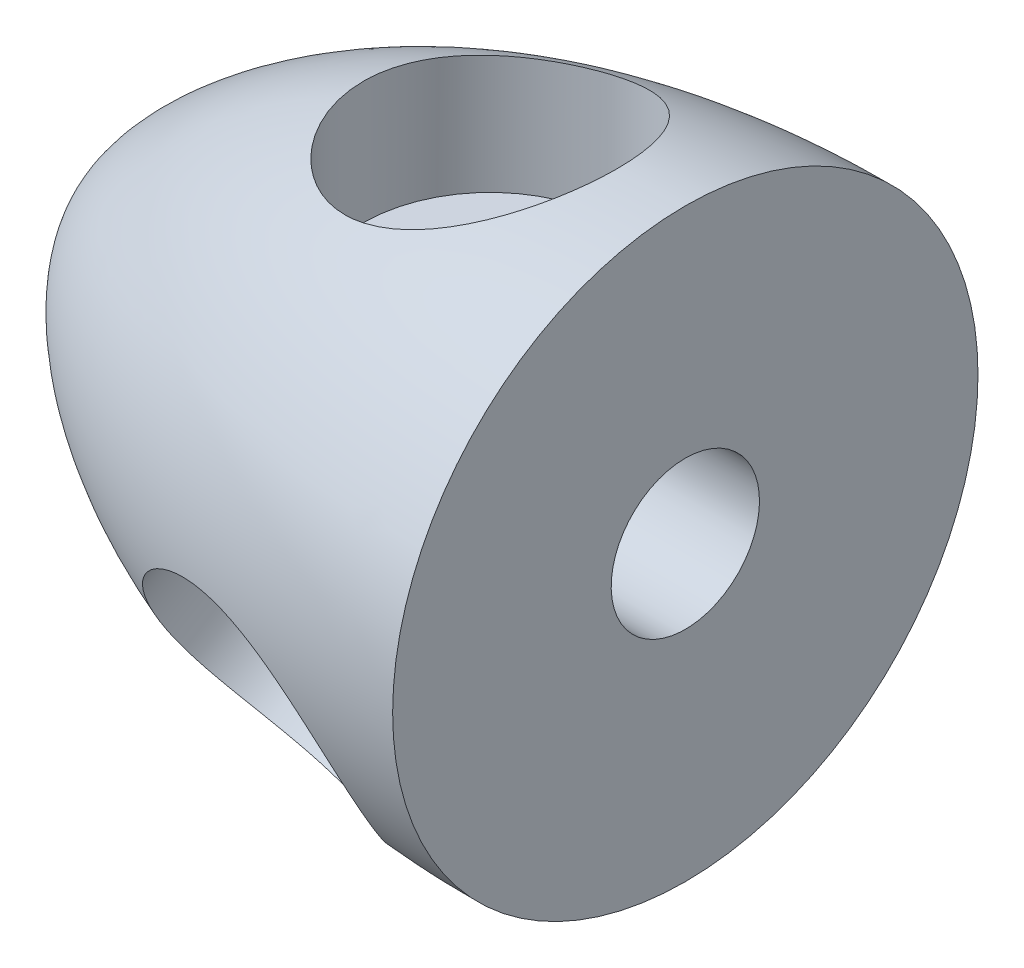
ISO-10303-21;
HEADER;
FILE_DESCRIPTION(('STEP AP214'),'2;1');
FILE_NAME('part.step','',(''),(''),'','','');
FILE_SCHEMA(('AUTOMOTIVE_DESIGN { 1 0 10303 214 1 1 1 1 }'));
ENDSEC;
DATA;
#1=APPLICATION_CONTEXT('core data for automotive mechanical design processes');
#2=APPLICATION_PROTOCOL_DEFINITION('international standard','automotive_design',2000,#1);
#3=PRODUCT_CONTEXT('',#1,'mechanical');
#4=PRODUCT('Part','Part','',(#3));
#5=PRODUCT_RELATED_PRODUCT_CATEGORY('part','',(#4));
#6=PRODUCT_DEFINITION_FORMATION('','',#4);
#7=PRODUCT_DEFINITION_CONTEXT('part definition',#1,'design');
#8=PRODUCT_DEFINITION('design','',#6,#7);
#9=PRODUCT_DEFINITION_SHAPE('','',#8);
#10=(LENGTH_UNIT() NAMED_UNIT(*) SI_UNIT(.MILLI.,.METRE.));
#11=(NAMED_UNIT(*) PLANE_ANGLE_UNIT() SI_UNIT($,.RADIAN.));
#12=(NAMED_UNIT(*) SI_UNIT($,.STERADIAN.) SOLID_ANGLE_UNIT());
#13=UNCERTAINTY_MEASURE_WITH_UNIT(LENGTH_MEASURE(1.E-05),#10,'distance_accuracy_value','');
#14=(GEOMETRIC_REPRESENTATION_CONTEXT(3) GLOBAL_UNCERTAINTY_ASSIGNED_CONTEXT((#13)) GLOBAL_UNIT_ASSIGNED_CONTEXT((#10,
#11,#12)) REPRESENTATION_CONTEXT('',''));
#15=CARTESIAN_POINT('',(0.,0.,0.));
#16=DIRECTION('',(0.,0.,1.));
#17=DIRECTION('',(1.,0.,0.));
#18=AXIS2_PLACEMENT_3D('',#15,#16,#17);
#19=CARTESIAN_POINT('',(0.,19.05,0.));
#20=CARTESIAN_POINT('',(-25.41,19.05,0.));
#21=CARTESIAN_POINT('',(-38.1,6.31666666666666,0.));
#22=CARTESIAN_POINT('',(-38.1,0.,0.));
#23=B_SPLINE_CURVE_WITH_KNOTS('',3,(#19,#20,#21,#22),.UNSPECIFIED.,.F.,.F.,(4,4),(0.,1.),.UNSPECIFIED.);
#24=CARTESIAN_POINT('',(0.,0.,0.));
#25=DIRECTION('',(1.,0.,0.));
#26=AXIS1_PLACEMENT('',#24,#25);
#27=SURFACE_OF_REVOLUTION('',#23,#26);
#28=CARTESIAN_POINT('',(-12.7,-15.0807249649027,9.61058185418369));
#29=CARTESIAN_POINT('',(-12.4605393669485,-15.1069278666825,9.65596906371833));
#30=CARTESIAN_POINT('',(-12.221808118706,-15.1258316157201,9.70956481400283));
#31=CARTESIAN_POINT('',(-11.7476073797647,-15.1490173761714,9.83220492568797));
#32=CARTESIAN_POINT('',(-11.5121385842366,-15.1532963176068,9.90125252743574));
#33=CARTESIAN_POINT('',(-11.045904513232,-15.1472399577647,10.0536959752813));
#34=CARTESIAN_POINT('',(-10.8151427802404,-15.1368940338036,10.137102212032));
#35=CARTESIAN_POINT('',(-10.3598307103795,-15.1015845420369,10.3169996420026));
#36=CARTESIAN_POINT('',(-10.135282904689,-15.0766151066774,10.413496075599));
#37=CARTESIAN_POINT('',(-9.69455055848924,-15.0121858162572,10.6178627940247));
#38=CARTESIAN_POINT('',(-9.47833937087406,-14.972777256637,10.7256918638841));
#39=CARTESIAN_POINT('',(-9.05453897157765,-14.8794464883134,10.9517069299745));
#40=CARTESIAN_POINT('',(-8.84695296078829,-14.825518946028,11.0698967214589));
#41=CARTESIAN_POINT('',(-8.44163353549176,-14.7031607649492,11.315230158228));
#42=CARTESIAN_POINT('',(-8.24389834225954,-14.6347327562595,11.4423721769634));
#43=CARTESIAN_POINT('',(-7.85932959360645,-14.4833598925009,11.7042745304693));
#44=CARTESIAN_POINT('',(-7.67249609672024,-14.4004149594956,11.8390349061376));
#45=CARTESIAN_POINT('',(-7.30255493412424,-14.2158869266265,12.1211158811441));
#46=CARTESIAN_POINT('',(-7.12000772587379,-14.1136252990654,12.2687290368562));
#47=CARTESIAN_POINT('',(-6.76941100154962,-13.8933427961317,12.569124046286));
#48=CARTESIAN_POINT('',(-6.60135453097225,-13.7753295504689,12.7219033710498));
#49=CARTESIAN_POINT('',(-6.2809035756407,-13.52359523197,13.0311272524021));
#50=CARTESIAN_POINT('',(-6.12851637427941,-13.3898669157838,13.1875734723209));
#51=CARTESIAN_POINT('',(-5.84095434989063,-13.1071101476181,13.5022684192315));
#52=CARTESIAN_POINT('',(-5.70577067283612,-12.9580896378949,13.6605161729762));
#53=CARTESIAN_POINT('',(-5.45875404251215,-12.651182176542,13.9710404308246));
#54=CARTESIAN_POINT('',(-5.34622579869089,-12.4938522486059,14.1233138524649));
#55=CARTESIAN_POINT('',(-5.13959288681326,-12.166207063187,14.4262107244172));
#56=CARTESIAN_POINT('',(-5.04547861487266,-11.9958986394436,14.5768349959424));
#57=CARTESIAN_POINT('',(-4.8767951845897,-11.6432494424563,14.8747482570029));
#58=CARTESIAN_POINT('',(-4.8022171610913,-11.460914173937,15.0220387315301));
#59=CARTESIAN_POINT('',(-4.67356441519808,-11.0853881684958,15.3116496454441));
#60=CARTESIAN_POINT('',(-4.61948743903761,-10.892198627512,15.453970629585));
#61=CARTESIAN_POINT('',(-4.53696860474139,-10.5163365125172,15.7180698823627));
#62=CARTESIAN_POINT('',(-4.50650179678199,-10.3345483331358,15.8404780287937));
#63=CARTESIAN_POINT('',(-4.46317468703724,-9.96474655992053,16.0788276686682));
#64=CARTESIAN_POINT('',(-4.45031307992681,-9.77673342869007,16.19476964093));
#65=CARTESIAN_POINT('',(-4.44236044599405,-9.39599612809252,16.4191576981804));
#66=CARTESIAN_POINT('',(-4.44726419038948,-9.20327336147216,16.5276059791725));
#67=CARTESIAN_POINT('',(-4.47476770642783,-8.81462758311886,16.7362002716799));
#68=CARTESIAN_POINT('',(-4.49736713851158,-8.61870463286428,16.8363464424619));
#69=CARTESIAN_POINT('',(-4.55819630809723,-8.23644609934095,17.022242003139));
#70=CARTESIAN_POINT('',(-4.59546679141257,-8.05019703391369,17.1084857919026));
#71=CARTESIAN_POINT('',(-4.68510735109891,-7.67757951839191,17.2726290150966));
#72=CARTESIAN_POINT('',(-4.73748262796273,-7.4912110492753,17.3505255629297));
#73=CARTESIAN_POINT('',(-4.85678172240798,-7.11977221169577,17.49768092338));
#74=CARTESIAN_POINT('',(-4.92370323779503,-6.9347016425968,17.5669411001261));
#75=CARTESIAN_POINT('',(-5.07146614423996,-6.56707101890579,17.6967431821676));
#76=CARTESIAN_POINT('',(-5.15230864905511,-6.38451116644813,17.7572843891843));
#77=CARTESIAN_POINT('',(-5.330348269328,-6.01659312679599,17.8716914073898));
#78=CARTESIAN_POINT('',(-5.42802859706451,-5.83137003069434,17.9252392610836));
#79=CARTESIAN_POINT('',(-5.63673491037814,-5.46609865807899,18.0231603473166));
#80=CARTESIAN_POINT('',(-5.74776142733062,-5.2860505879616,18.0675332143645));
#81=CARTESIAN_POINT('',(-5.98233268584435,-4.93221325199068,18.1473655421662));
#82=CARTESIAN_POINT('',(-6.10587867552496,-4.75842461251195,18.182824112987));
#83=CARTESIAN_POINT('',(-6.36464305547803,-4.41812168112,18.2451673308644));
#84=CARTESIAN_POINT('',(-6.49986563796949,-4.25161003443402,18.2720488821351));
#85=CARTESIAN_POINT('',(-6.94797044187672,-3.73426325669477,18.3446167914572));
#86=CARTESIAN_POINT('',(-7.28153453154595,-3.39876846674789,18.3748510881378));
#87=CARTESIAN_POINT('',(-7.99247832563231,-2.77619499868566,18.4007205758807));
#88=CARTESIAN_POINT('',(-8.36988094834161,-2.48914183939087,18.3963375884757));
#89=CARTESIAN_POINT('',(-8.97756649974315,-2.09158861741545,18.3668336001337));
#90=CARTESIAN_POINT('',(-9.19533989376557,-1.9607576066401,18.352219795734));
#91=CARTESIAN_POINT('',(-9.63996153383115,-1.71689485953685,18.3151747349516));
#92=CARTESIAN_POINT('',(-9.86680651128454,-1.60385678340804,18.2927462722052));
#93=CARTESIAN_POINT('',(-10.3283588817229,-1.39681669502915,18.2408006760878));
#94=CARTESIAN_POINT('',(-10.5630697064393,-1.30282312095339,18.2112804131115));
#95=CARTESIAN_POINT('',(-11.0386990432141,-1.1352385622252,18.1458806258716));
#96=CARTESIAN_POINT('',(-11.2796145949742,-1.06163803807467,18.1100040878778));
#97=CARTESIAN_POINT('',(-11.7625603368913,-0.936904547781502,18.0331138059807));
#98=CARTESIAN_POINT('',(-12.0045227842152,-0.885458956010981,17.992182800394));
#99=CARTESIAN_POINT('',(-12.4912304779651,-0.804505986551966,17.9053598796474));
#100=CARTESIAN_POINT('',(-12.7359757241654,-0.774998607082446,17.8594679648901));
#101=CARTESIAN_POINT('',(-13.2261347731555,-0.738736326128271,17.7632543111359));
#102=CARTESIAN_POINT('',(-13.4715480691337,-0.731967370911766,17.7129353280817));
#103=CARTESIAN_POINT('',(-13.9610465868865,-0.741647611214413,17.6082465270173));
#104=CARTESIAN_POINT('',(-14.2051319239279,-0.758094758228111,17.5538770668077));
#105=CARTESIAN_POINT('',(-14.6695347123585,-0.811984772606293,17.446052285442));
#106=CARTESIAN_POINT('',(-14.8901396022859,-0.847566336251898,17.3928974749928));
#107=CARTESIAN_POINT('',(-15.3265521513244,-0.938129785994553,17.2835323913247));
#108=CARTESIAN_POINT('',(-15.5423600891888,-0.993110541645796,17.2273222963073));
#109=CARTESIAN_POINT('',(-15.9673962721091,-1.12195570337177,17.1118669137019));
#110=CARTESIAN_POINT('',(-16.1766252317393,-1.19581805061545,17.0526219575952));
#111=CARTESIAN_POINT('',(-16.5868391885007,-1.36163912773266,16.931007756899));
#112=CARTESIAN_POINT('',(-16.7878242340637,-1.453597751275,16.8686385306689));
#113=CARTESIAN_POINT('',(-17.1721793022509,-1.65058270051193,16.7431520788185));
#114=CARTESIAN_POINT('',(-17.3559318537541,-1.75494551223342,16.6801627898417));
#115=CARTESIAN_POINT('',(-17.713162535653,-1.97836042214489,16.5509190407157));
#116=CARTESIAN_POINT('',(-17.8866369694445,-2.09741775843614,16.4846634213139));
#117=CARTESIAN_POINT('',(-18.2220277470755,-2.3489475538586,16.3486866254338));
#118=CARTESIAN_POINT('',(-18.3839474742436,-2.48141605836497,16.2789664736309));
#119=CARTESIAN_POINT('',(-18.6953147557871,-2.75856818385893,16.1357556709637));
#120=CARTESIAN_POINT('',(-18.8447565683992,-2.90325736731195,16.0622633091445));
#121=CARTESIAN_POINT('',(-19.1344358331487,-3.20795674974938,15.9090266280704));
#122=CARTESIAN_POINT('',(-19.2742627562029,-3.36829632262149,15.8291609032954));
#123=CARTESIAN_POINT('',(-19.5386381176169,-3.69886513700155,15.6650087831962));
#124=CARTESIAN_POINT('',(-19.6631928547628,-3.86909025838448,15.5807242309665));
#125=CARTESIAN_POINT('',(-19.8963393727746,-4.21804224752951,15.4075008524445));
#126=CARTESIAN_POINT('',(-20.0049232359595,-4.39677327443419,15.3185597470592));
#127=CARTESIAN_POINT('',(-20.2052998498126,-4.76103912474137,15.1360282810149));
#128=CARTESIAN_POINT('',(-20.2970986359869,-4.94657147363169,15.0424396069621));
#129=CARTESIAN_POINT('',(-20.4653881824239,-5.32760038691978,14.8482578899989));
#130=CARTESIAN_POINT('',(-20.5414447116619,-5.52322988072452,14.7475489226243));
#131=CARTESIAN_POINT('',(-20.67476953156,-5.91839783123482,14.5414609363923));
#132=CARTESIAN_POINT('',(-20.7320374979508,-6.11793635534281,14.4360818369695));
#133=CARTESIAN_POINT('',(-20.8273498579983,-6.51925683346048,14.2210192874244));
#134=CARTESIAN_POINT('',(-20.8653955409287,-6.72103863608134,14.1113361265152));
#135=CARTESIAN_POINT('',(-20.9219749034197,-7.12524384341142,13.8881872093644));
#136=CARTESIAN_POINT('',(-20.9405088399869,-7.32766723963442,13.7747215029663));
#137=CARTESIAN_POINT('',(-20.9578428889139,-7.72980109575986,13.5457311280027));
#138=CARTESIAN_POINT('',(-20.9568175573193,-7.92951964872132,13.4302338544922));
#139=CARTESIAN_POINT('',(-20.935468175318,-8.3266305167301,13.1970465831155));
#140=CARTESIAN_POINT('',(-20.9151442080143,-8.52402284179081,13.0793565946935));
#141=CARTESIAN_POINT('',(-20.855353660185,-8.91514984869992,12.842766901934));
#142=CARTESIAN_POINT('',(-20.8158869184955,-9.1088844997399,12.7238671874199));
#143=CARTESIAN_POINT('',(-20.7181091005704,-9.49147712676378,12.4859726330807));
#144=CARTESIAN_POINT('',(-20.6597979861123,-9.68033509285528,12.3669777930631));
#145=CARTESIAN_POINT('',(-20.5249814447227,-10.0514753390725,12.1305041544679));
#146=CARTESIAN_POINT('',(-20.4485357624742,-10.2337769945752,12.0130216857482));
#147=CARTESIAN_POINT('',(-20.2778943169797,-10.5914889712961,11.780485218404));
#148=CARTESIAN_POINT('',(-20.1836985884966,-10.7668993060099,11.665431215024));
#149=CARTESIAN_POINT('',(-19.9782182232067,-11.1099711373527,11.4391399582326));
#150=CARTESIAN_POINT('',(-19.8669352590076,-11.2776333903258,11.3279023325522));
#151=CARTESIAN_POINT('',(-19.6279705421923,-11.6045674132099,11.110613068136));
#152=CARTESIAN_POINT('',(-19.5002812315946,-11.7638352680503,11.0045638508522));
#153=CARTESIAN_POINT('',(-19.2277492787476,-12.0751314300538,10.7979250230322));
#154=CARTESIAN_POINT('',(-19.0827171677642,-12.2270483398481,10.6974173479647));
#155=CARTESIAN_POINT('',(-18.7778327354918,-12.5208745526552,10.5048514687184));
#156=CARTESIAN_POINT('',(-18.6179873733718,-12.6627885003772,10.4127893369245));
#157=CARTESIAN_POINT('',(-18.2845006179332,-12.9361788389015,10.2385530847935));
#158=CARTESIAN_POINT('',(-18.1108564414537,-13.0676531133217,10.1563809676765));
#159=CARTESIAN_POINT('',(-17.751057572462,-13.3196376566173,10.0033972467433));
#160=CARTESIAN_POINT('',(-17.5649032153389,-13.4401482192182,9.93258533854027));
#161=CARTESIAN_POINT('',(-17.1841398591054,-13.6681647761994,9.80454881094955));
#162=CARTESIAN_POINT('',(-16.9896835491877,-13.7758276846749,9.74714969019101));
#163=CARTESIAN_POINT('',(-16.5914490639366,-13.9796572994602,9.64581426074389));
#164=CARTESIAN_POINT('',(-16.3876707493686,-14.0758238339808,9.60187815321631));
#165=CARTESIAN_POINT('',(-15.9725583400651,-14.2562392738774,9.52839605427178));
#166=CARTESIAN_POINT('',(-15.7612294303005,-14.3404961677533,9.49884038423559));
#167=CARTESIAN_POINT('',(-15.332613772925,-14.4968573344472,9.45471192792104));
#168=CARTESIAN_POINT('',(-15.1153277877478,-14.5689631540913,9.440137233365));
#169=CARTESIAN_POINT('',(-14.7160724018487,-14.6889146520175,9.42753806028446));
#170=CARTESIAN_POINT('',(-14.5347839586833,-14.7387910110535,9.42700732248302));
#171=CARTESIAN_POINT('',(-14.1703064777934,-14.8301254522127,9.43626007445521));
#172=CARTESIAN_POINT('',(-13.9871169828581,-14.8715814574599,9.44604610517916));
#173=CARTESIAN_POINT('',(-13.6198599876643,-14.9459784093363,9.47583038309213));
#174=CARTESIAN_POINT('',(-13.4357925587292,-14.9789200360662,9.49582781424805));
#175=CARTESIAN_POINT('',(-13.0676737893222,-15.0362473497707,9.5458011870076));
#176=CARTESIAN_POINT('',(-12.8836224525701,-15.0606321378357,9.57577817633545));
#177=CARTESIAN_POINT('',(-12.7,-15.0807249649027,9.61058185418369));
#178=B_SPLINE_CURVE_WITH_KNOTS('',3,(#28,#29,#30,#31,#32,#33,#34,#35,#36,#37,#38,#39,#40,#41,
#42,#43,#44,#45,#46,#47,#48,#49,#50,#51,#52,#53,#54,#55,#56,#57,#58,#59,#60,#61,#62,#63,#64,#65,
#66,#67,#68,#69,#70,#71,#72,#73,#74,#75,#76,#77,#78,#79,#80,#81,#82,#83,#84,#85,#86,#87,#88,#89,
#90,#91,#92,#93,#94,#95,#96,#97,#98,#99,#100,#101,#102,#103,#104,#105,#106,#107,#108,#109,#110,
#111,#112,#113,#114,#115,#116,#117,#118,#119,#120,#121,#122,#123,#124,#125,#126,#127,#128,#129,
#130,#131,#132,#133,#134,#135,#136,#137,#138,#139,#140,#141,#142,#143,#144,#145,#146,#147,#148,
#149,#150,#151,#152,#153,#154,#155,#156,#157,#158,#159,#160,#161,#162,#163,#164,#165,#166,#167,
#168,#169,#170,#171,#172,#173,#174,#175,#176,#177),.UNSPECIFIED.,.T.,.F.,(4,2,2,2,2,2,2,2,2,2,2,
2,2,2,2,2,2,2,2,2,2,2,2,2,2,2,2,2,2,2,2,2,2,2,2,2,2,2,2,2,2,2,2,2,2,2,2,2,2,2,2,2,2,2,2,2,2,2,2,
2,2,2,2,2,2,2,2,2,2,2,2,2,2,2,4),(0.,0.735198682196382,1.47055168474074,2.20643908107365,
2.94262194816174,3.6762144664281,4.41007684018643,5.14380621929081,5.87753953765778,
6.64480401312788,7.41169818355629,8.17894722561999,8.94579978172901,9.68332567767393,
10.4204658824723,11.1572710061693,11.893995106301,12.5569369824932,13.2198297026698,
13.8825273329804,14.5452122472243,15.1703097710936,15.7956227698737,16.4208368739995,
17.0461010220211,17.6938282993614,18.3415813743567,18.9893990902553,19.6374503653932,
21.0532693523906,22.4698318734464,23.2324733340281,23.9948424396814,24.757548598155,
25.5198973718821,26.2711050483508,27.0223126638336,27.773055901723,28.523732900867,
29.2119343208209,29.9000956439524,30.5881819626011,31.2762642382716,31.9370367036341,
32.5980453960373,33.2588597377734,33.9199764991192,34.6009231480087,35.2815879990863,
35.9625891656526,36.6433449771117,37.3409194799903,38.038506021577,38.7360457685436,
39.4335763274789,40.1248847336411,40.8161901629361,41.5075014124662,42.1988140642171,
42.8878800519782,43.5769446902424,44.2659419214122,44.9552577015858,45.6529440360383,
46.3503042477116,47.0478054726636,47.7452880055598,48.4331163602257,49.1209549917503,
49.8083300373111,50.495617514137,51.0592272631143,51.6229758577981,52.1866794081673,
52.7504421587742),.UNSPECIFIED.);
#179=CARTESIAN_POINT('',(-12.7,-15.0807249649027,9.61058185418369));
#180=VERTEX_POINT('',#179);
#181=EDGE_CURVE('E48',#180,#180,#178,.T.);
#182=ORIENTED_EDGE('',*,*,#181,.F.);
#183=EDGE_LOOP('',(#182));
#184=FACE_BOUND('',#183,.T.);
#185=CARTESIAN_POINT('',(-12.7,-0.782645548421408,-17.8655818541838));
#186=CARTESIAN_POINT('',(-12.4605393669485,-0.808850573995399,-17.9109678375453));
#187=CARTESIAN_POINT('',(-12.221808118706,-0.845813980757831,-17.9541368395809));
#188=CARTESIAN_POINT('',(-11.7476073797647,-0.940430552774474,-18.0355363529803));
#189=CARTESIAN_POINT('',(-11.5121385842366,-0.998088059240766,-18.0737658258385));
#190=CARTESIAN_POINT('',(-11.045904513232,-1.13313613763657,-18.1447425882836));
#191=CARTESIAN_POINT('',(-10.8151427802404,-1.21054101947724,-18.177485873683));
#192=CARTESIAN_POINT('',(-10.3598307103795,-1.3839915097907,-18.2368556718036));
#193=CARTESIAN_POINT('',(-10.135282904689,-1.48004459033948,-18.2634797232623));
#194=CARTESIAN_POINT('',(-9.69455055848924,-1.68924600539429,-18.3098656802235));
#195=CARTESIAN_POINT('',(-9.47833937087406,-1.80233299896911,-18.3296514013955));
#196=CARTESIAN_POINT('',(-9.05453897157765,-2.04473317200322,-18.3618321181178));
#197=CARTESIAN_POINT('',(-8.84695296078828,-2.17405230503944,-18.3742243922772));
#198=CARTESIAN_POINT('',(-8.44163353549175,-2.44769638421856,-18.3909258174867));
#199=CARTESIAN_POINT('',(-8.24389834225953,-2.59201860667667,-18.3952364329987));
#200=CARTESIAN_POINT('',(-7.85932959360645,-2.89451913000306,-18.3950948642931));
#201=CARTESIAN_POINT('',(-7.67249609672024,-3.05269750525798,-18.3906426330294));
#202=CARTESIAN_POINT('',(-7.30255493412424,-3.38925081197249,-18.3718771563577));
#203=CARTESIAN_POINT('',(-7.12000772587379,-3.56821836853249,-18.3571225669135));
#204=CARTESIAN_POINT('',(-6.76941100154962,-3.93850932933554,-18.3165498280786));
#205=CARTESIAN_POINT('',(-6.60135453097225,-4.12982672858556,-18.2907370217334));
#206=CARTESIAN_POINT('',(-6.2809035756407,-4.52348962454285,-18.2273406475851));
#207=CARTESIAN_POINT('',(-6.12851637427941,-4.7258401834117,-18.189751638522));
#208=CARTESIAN_POINT('',(-5.84095434989063,-5.13975238596168,-18.1022245676539));
#209=CARTESIAN_POINT('',(-5.70577067283612,-5.35130921565803,-18.052292897421));
#210=CARTESIAN_POINT('',(-5.45875404251215,-5.77368484212252,-17.9417653682026));
#211=CARTESIAN_POINT('',(-5.34622579869089,-5.98422245755225,-17.8816503646545));
#212=CARTESIAN_POINT('',(-5.13959288681326,-6.41036143609922,-17.7493497466302));
#213=CARTESIAN_POINT('',(-5.04547861487266,-6.62596009353828,-17.6771704609526));
#214=CARTESIAN_POINT('',(-4.8767951845897,-7.06028514423461,-17.5207239282676));
#215=CARTESIAN_POINT('',(-4.8022171610913,-7.27901007117028,-17.4364621909876));
#216=CARTESIAN_POINT('',(-4.67356441519808,-7.71758348255362,-17.2560525874509));
#217=CARTESIAN_POINT('',(-4.61948743903761,-7.93743184080315,-17.159906029284));
#218=CARTESIAN_POINT('',(-4.53696860474139,-8.35407956032652,-16.9664495157672));
#219=CARTESIAN_POINT('',(-4.50650179678199,-8.55098221445664,-16.8702204075306));
#220=CARTESIAN_POINT('',(-4.46317468703724,-8.94229994417844,-16.6691374974989));
#221=CARTESIAN_POINT('',(-4.45031307992681,-9.13671520313729,-16.5642843357392));
#222=CARTESIAN_POINT('',(-4.44236044599405,-9.5214096113207,-16.3467501898786));
#223=CARTESIAN_POINT('',(-4.44726419038948,-9.71168996096683,-16.2340715185938));
#224=CARTESIAN_POINT('',(-4.47476770642783,-10.0866608065393,-16.0017915477199));
#225=CARTESIAN_POINT('',(-4.49736713851158,-10.2713514096556,-15.8821903810061));
#226=CARTESIAN_POINT('',(-4.55819630809723,-10.6234709544144,-15.6440925605001));
#227=CARTESIAN_POINT('',(-4.59546679141257,-10.7912847991159,-15.5259180327908));
#228=CARTESIAN_POINT('',(-4.68510735109892,-11.1197457580218,-15.2852934100508));
#229=CARTESIAN_POINT('',(-4.73748262796274,-11.2803903818707,-15.162841855248));
#230=CARTESIAN_POINT('',(-4.85678172240798,-11.5935500811135,-14.9147440661771));
#231=CARTESIAN_POINT('',(-4.92370323779503,-11.7460664381957,-14.7890983402176));
#232=CARTESIAN_POINT('',(-5.07146614423996,-12.0422936505533,-14.5356219219128));
#233=CARTESIAN_POINT('',(-5.15230864905511,-12.1860038000343,-14.4077910554817));
#234=CARTESIAN_POINT('',(-5.330348269328,-12.4690422039976,-14.1463681957351));
#235=CARTESIAN_POINT('',(-5.42802859706451,-12.6080275536653,-14.0127342159904));
#236=CARTESIAN_POINT('',(-5.63673491037814,-12.875465388217,-13.7453604711468));
#237=CARTESIAN_POINT('',(-5.74776142733063,-13.0039174533779,-13.6116207020467));
#238=CARTESIAN_POINT('',(-5.98233268584435,-13.2499729452829,-13.3451047441894));
#239=CARTESIAN_POINT('',(-6.10587867552496,-13.367575288135,-13.212328652922));
#240=CARTESIAN_POINT('',(-6.36464305547803,-13.5917175642664,-12.948789278293));
#241=CARTESIAN_POINT('',(-6.49986563796949,-13.6982534939029,-12.8180267378723));
#242=CARTESIAN_POINT('',(-6.94797044187672,-14.0197725357451,-12.4062752404452));
#243=CARTESIAN_POINT('',(-7.28153453154595,-14.2137035997095,-12.1308453778541));
#244=CARTESIAN_POINT('',(-7.99247832563231,-14.5473939673088,-11.6046156826615));
#245=CARTESIAN_POINT('',(-8.36988094834161,-14.687124768519,-11.3538288607731));
#246=CARTESIAN_POINT('',(-8.97756649974314,-14.8603501760896,-10.9947856770151));
#247=CARTESIAN_POINT('',(-9.19533989376557,-14.9131097556212,-10.874175795881));
#248=CARTESIAN_POINT('',(-9.63996153383115,-15.0029591654505,-10.6444619314617));
#249=CARTESIAN_POINT('',(-9.86680651128454,-15.0400545850088,-10.535353854566));
#250=CARTESIAN_POINT('',(-10.3283588817229,-15.0985884233458,-10.3300790803694));
#251=CARTESIAN_POINT('',(-10.5630697064393,-15.1200199127198,-10.2339181259392));
#252=CARTESIAN_POINT('',(-11.0386990432141,-15.147174314932,-10.0560857471786));
#253=CARTESIAN_POINT('',(-11.2796145949742,-15.1529045837048,-9.9744075545355));
#254=CARTESIAN_POINT('',(-11.7625603368913,-15.1486823914243,-9.82794004229035));
#255=CARTESIAN_POINT('',(-12.0045227842151,-15.1389578966691,-9.76292135011103));
#256=CARTESIAN_POINT('',(-12.4912304779651,-15.1042435264013,-9.64940256167442));
#257=CARTESIAN_POINT('',(-12.7359757241654,-15.079253652128,-9.60090246407608));
#258=CARTESIAN_POINT('',(-13.2261347731555,-15.014061324263,-9.52139158069349));
#259=CARTESIAN_POINT('',(-13.4715480691337,-14.9738682842536,-9.49037000199179));
#260=CARTESIAN_POINT('',(-13.9610465868865,-14.8783650028889,-9.44640893547645));
#261=CARTESIAN_POINT('',(-14.2051319239279,-14.8230560956505,-9.4334678525053));
#262=CARTESIAN_POINT('',(-14.6695347123585,-14.7027320886412,-9.42622558328426));
#263=CARTESIAN_POINT('',(-14.8901396022859,-14.638907890636,-9.43046271608314));
#264=CARTESIAN_POINT('',(-15.3265521513244,-14.4989132250211,-9.45421042238058));
#265=CARTESIAN_POINT('',(-15.5423600891888,-14.4227434769613,-9.4737201059851));
#266=CARTESIAN_POINT('',(-15.9673962721091,-14.2583336017583,-9.5275755978918));
#267=CARTESIAN_POINT('',(-16.1766252317393,-14.170094791102,-9.56191978893461));
#268=CARTESIAN_POINT('',(-16.5868391885007,-13.9818632652795,-9.64471795385292));
#269=CARTESIAN_POINT('',(-16.7878242340637,-13.8818706191787,-9.69317184482261));
#270=CARTESIAN_POINT('',(-17.1721793022509,-13.6747036894271,-9.80102258909978));
#271=CARTESIAN_POINT('',(-17.3559318537541,-13.5679719591461,-9.85990879077254));
#272=CARTESIAN_POINT('',(-17.713162535653,-13.3443361341669,-9.98876990377707));
#273=CARTESIAN_POINT('',(-17.8866369694445,-13.2274284164758,-10.0587487718113));
#274=CARTESIAN_POINT('',(-18.2220277470755,-12.9839041592072,-10.2085915665158));
#275=CARTESIAN_POINT('',(-18.3839474742436,-12.857290484337,-10.2884525807182));
#276=CARTESIAN_POINT('',(-18.6953147557871,-12.5946902283839,-10.4568679607753));
#277=CARTESIAN_POINT('',(-18.8447565683992,-12.4586993843378,-10.5454262883888));
#278=CARTESIAN_POINT('',(-19.1344358331487,-12.1736428345173,-10.73268535356));
#279=CARTESIAN_POINT('',(-19.2742627562029,-12.0243073015345,-10.8316106345117));
#280=CARTESIAN_POINT('',(-19.5386381176169,-11.7168629882535,-11.0358155654141));
#281=CARTESIAN_POINT('',(-19.6631928547628,-11.5587578641844,-11.1410925687791));
#282=CARTESIAN_POINT('',(-19.8963393727746,-11.2342660232826,-11.3566821668189));
#283=CARTESIAN_POINT('',(-20.0049232359595,-11.0678752531258,-11.4669972238701));
#284=CARTESIAN_POINT('',(-20.2052998498126,-10.7276654413879,-11.6911949709451));
#285=CARTESIAN_POINT('',(-20.2970986359868,-10.5538490977065,-11.8050763612816));
#286=CARTESIAN_POINT('',(-20.4653881824239,-10.1951683412219,-12.0379662212839));
#287=CARTESIAN_POINT('',(-20.5414447116619,-10.0101370701841,-12.1570318489609));
#288=CARTESIAN_POINT('',(-20.67476953156,-9.63407566343734,-12.3962133397483));
#289=CARTESIAN_POINT('',(-20.7320374979508,-9.44304542425525,-12.516329220948));
#290=CARTESIAN_POINT('',(-20.8273498579983,-9.05613555388766,-12.7563516752843));
#291=CARTESIAN_POINT('',(-20.8653955409287,-8.86025624886255,-12.8762582619208));
#292=CARTESIAN_POINT('',(-20.9219749034197,-8.4649010141179,-13.1147357812352));
#293=CARTESIAN_POINT('',(-20.9405088399869,-8.2654251318073,-13.2333067314856));
#294=CARTESIAN_POINT('',(-20.9578428889139,-7.86604672180394,-13.4670696791302));
#295=CARTESIAN_POINT('',(-20.9568175573193,-7.66616387239534,-13.5822823828467));
#296=CARTESIAN_POINT('',(-20.935468175318,-7.26566233753954,-13.8095968469728));
#297=CARTESIAN_POINT('',(-20.9151442080143,-7.06504365526466,-13.9216986207765));
#298=CARTESIAN_POINT('',(-20.855353660185,-6.66458746760676,-14.1421296984861));
#299=CARTESIAN_POINT('',(-20.8158869184955,-6.46474996881484,-14.250458970623));
#300=CARTESIAN_POINT('',(-20.7181091005704,-6.06743092782318,-14.4628466277567));
#301=CARTESIAN_POINT('',(-20.6597979861123,-5.86994939040296,-14.5669050040902));
#302=CARTESIAN_POINT('',(-20.5249814447227,-5.47958708894552,-14.7700850663835));
#303=CARTESIAN_POINT('',(-20.4485357624742,-5.2866934587836,-14.869221696841));
#304=CARTESIAN_POINT('',(-20.2778943169797,-4.90645498239684,-15.0627411222472));
#305=CARTESIAN_POINT('',(-20.1836985884966,-4.71911012530578,-15.1571239265056));
#306=CARTESIAN_POINT('',(-19.9782182232067,-4.35160023259869,-15.3410872193756));
#307=CARTESIAN_POINT('',(-19.8669352590076,-4.17143449641626,-15.4306681768659));
#308=CARTESIAN_POINT('',(-19.6279705421923,-3.81978946202012,-15.6051567138369));
#309=CARTESIAN_POINT('',(-19.5002812315946,-3.64831421838067,-15.690062113493));
#310=CARTESIAN_POINT('',(-19.2277492787476,-3.31371166307864,-15.8563330839786));
#311=CARTESIAN_POINT('',(-19.0827171677642,-3.15071100829765,-15.9376431495912));
#312=CARTESIAN_POINT('',(-18.7778327354918,-2.83703095856472,-16.0958211745567));
#313=CARTESIAN_POINT('',(-18.6179873733718,-2.68634583984365,-16.1726911925384));
#314=CARTESIAN_POINT('',(-18.2845006179332,-2.39875764997584,-16.3223360447842));
#315=CARTESIAN_POINT('',(-18.1108564414537,-2.26185737185968,-16.3951100478177));
#316=CARTESIAN_POINT('',(-17.751057572462,-2.00337731151831,-16.5368432032061));
#317=CARTESIAN_POINT('',(-17.5649032153389,-1.88179711882359,-16.6058024577413));
#318=CARTESIAN_POINT('',(-17.1841398591054,-1.65690595482707,-16.7392523247751));
#319=CARTESIAN_POINT('',(-16.9896835491877,-1.55336540385749,-16.803791578181));
#320=CARTESIAN_POINT('',(-16.5914490639366,-1.36369154026027,-16.929645487905));
#321=CARTESIAN_POINT('',(-16.3876707493686,-1.27755848773768,-16.99096009603));
#322=CARTESIAN_POINT('',(-15.9725583400651,-1.12371340337998,-17.1104634007432));
#323=CARTESIAN_POINT('',(-15.7612294303005,-1.05598899536481,-17.1686541762656));
#324=CARTESIAN_POINT('',(-15.332613772925,-0.939592047819676,-17.2820026906306));
#325=CARTESIAN_POINT('',(-15.1153277877478,-0.890917082259695,-17.337160814925));
#326=CARTESIAN_POINT('',(-14.7160724018487,-0.820030129342207,-17.4347422728108));
#327=CARTESIAN_POINT('',(-14.5347839586833,-0.794632317405408,-17.4776710978835));
#328=CARTESIAN_POINT('',(-14.1703064777934,-0.756978215088623,-17.561395420154));
#329=CARTESIAN_POINT('',(-13.9871169828581,-0.744725163674205,-17.6021903891994));
#330=CARTESIAN_POINT('',(-13.6198599876643,-0.73332062904198,-17.681512178445));
#331=CARTESIAN_POINT('',(-13.4357925587292,-0.734168099068466,-17.7200391796131));
#332=CARTESIAN_POINT('',(-13.0676737893222,-0.748782652538807,-17.7946727759917));
#333=CARTESIAN_POINT('',(-12.8836224525701,-0.762551092793195,-17.8307791165858));
#334=CARTESIAN_POINT('',(-12.7,-0.782645548421408,-17.8655818541838));
#335=B_SPLINE_CURVE_WITH_KNOTS('',3,(#185,#186,#187,#188,#189,#190,#191,#192,#193,#194,#195,
#196,#197,#198,#199,#200,#201,#202,#203,#204,#205,#206,#207,#208,#209,#210,#211,#212,#213,#214,
#215,#216,#217,#218,#219,#220,#221,#222,#223,#224,#225,#226,#227,#228,#229,#230,#231,#232,#233,
#234,#235,#236,#237,#238,#239,#240,#241,#242,#243,#244,#245,#246,#247,#248,#249,#250,#251,#252,
#253,#254,#255,#256,#257,#258,#259,#260,#261,#262,#263,#264,#265,#266,#267,#268,#269,#270,#271,
#272,#273,#274,#275,#276,#277,#278,#279,#280,#281,#282,#283,#284,#285,#286,#287,#288,#289,#290,
#291,#292,#293,#294,#295,#296,#297,#298,#299,#300,#301,#302,#303,#304,#305,#306,#307,#308,#309,
#310,#311,#312,#313,#314,#315,#316,#317,#318,#319,#320,#321,#322,#323,#324,#325,#326,#327,#328,
#329,#330,#331,#332,#333,#334),.UNSPECIFIED.,.T.,.F.,(4,2,2,2,2,2,2,2,2,2,2,2,2,2,2,2,2,2,2,2,2,
2,2,2,2,2,2,2,2,2,2,2,2,2,2,2,2,2,2,2,2,2,2,2,2,2,2,2,2,2,2,2,2,2,2,2,2,2,2,2,2,2,2,2,2,2,2,2,2,
2,2,2,2,2,4),(0.,0.735198682196383,1.47055168474074,2.20643908107365,2.94262194816174,
3.6762144664281,4.41007684018643,5.14380621929081,5.87753953765779,6.64480401312788,
7.4116981835563,8.17894722561999,8.94579978172901,9.68332567767393,10.4204658824722,
11.1572710061693,11.8939951063009,12.5569369824932,13.2198297026698,13.8825273329804,
14.5452122472243,15.1703097710936,15.7956227698737,16.4208368739995,17.0461010220211,
17.6938282993614,18.3415813743567,18.9893990902553,19.6374503653932,21.0532693523906,
22.4698318734463,23.2324733340281,23.9948424396814,24.757548598155,25.5198973718821,
26.2711050483508,27.0223126638336,27.773055901723,28.5237329008669,29.2119343208209,
29.9000956439524,30.5881819626011,31.2762642382716,31.937036703634,32.5980453960373,
33.2588597377734,33.9199764991192,34.6009231480087,35.2815879990863,35.9625891656526,
36.6433449771117,37.3409194799903,38.038506021577,38.7360457685436,39.4335763274789,
40.1248847336411,40.8161901629361,41.5075014124662,42.1988140642171,42.8878800519782,
43.5769446902424,44.2659419214123,44.9552577015858,45.6529440360383,46.3503042477116,
47.0478054726636,47.7452880055598,48.4331163602257,49.1209549917503,49.8083300373111,
50.495617514137,51.0592272631143,51.6229758577981,52.1866794081673,52.7504421587742),.UNSPECIFIED.);
#336=CARTESIAN_POINT('',(-12.7,-0.782645548421408,-17.8655818541838));
#337=VERTEX_POINT('',#336);
#338=EDGE_CURVE('E87',#337,#337,#335,.T.);
#339=ORIENTED_EDGE('',*,*,#338,.F.);
#340=EDGE_LOOP('',(#339));
#341=FACE_BOUND('',#340,.T.);
#342=CARTESIAN_POINT('',(-4.445,18.9160923559941,0.));
#343=CARTESIAN_POINT('',(-4.44500015064134,18.9160922479623,-0.216080182653123));
#344=CARTESIAN_POINT('',(-4.4534929552215,18.9118633663215,-0.432162867977076));
#345=CARTESIAN_POINT('',(-4.48736047476961,18.8950324319735,-0.862670784285229));
#346=CARTESIAN_POINT('',(-4.51273540002472,18.8824302749671,-1.07709599458992));
#347=CARTESIAN_POINT('',(-4.5800694589603,18.8490987904557,-1.50272699074223));
#348=CARTESIAN_POINT('',(-4.6220321261616,18.8283677313396,-1.71393208067756));
#349=CARTESIAN_POINT('',(-4.72205826379835,18.7791776710528,-2.13156744399538));
#350=CARTESIAN_POINT('',(-4.78012179030362,18.7507186429701,-2.33799770074723));
#351=CARTESIAN_POINT('',(-4.91153111972869,18.6866915681897,-2.74412115458382));
#352=CARTESIAN_POINT('',(-4.98483255345849,18.6511441731306,-2.94383199763214));
#353=CARTESIAN_POINT('',(-5.14608713243477,18.5735124480598,-3.3359200963083));
#354=CARTESIAN_POINT('',(-5.23404022094995,18.5314281433591,-3.52829738032816));
#355=CARTESIAN_POINT('',(-5.42379490081342,18.4414217751103,-3.9046478436648));
#356=CARTESIAN_POINT('',(-5.5255957073038,18.3935000424307,-4.08862149849179));
#357=CARTESIAN_POINT('',(-5.74225332795721,18.2925477068686,-4.44732655210278));
#358=CARTESIAN_POINT('',(-5.85711517467897,18.2395151359336,-4.62205435010165));
#359=CARTESIAN_POINT('',(-6.10534541613452,18.1262518427806,-4.97027340316896));
#360=CARTESIAN_POINT('',(-6.23936664946168,18.0657899392519,-5.14322467168531));
#361=CARTESIAN_POINT('',(-6.51995154640259,17.9410125446037,-5.47719262496659));
#362=CARTESIAN_POINT('',(-6.66651981102147,17.8766956424684,-5.63820489095114));
#363=CARTESIAN_POINT('',(-7.12359872561871,17.6793865031343,-6.10222695378908));
#364=CARTESIAN_POINT('',(-7.4516208767371,17.5419720711316,-6.38641349875021));
#365=CARTESIAN_POINT('',(-8.17985496598712,17.249847579087,-6.92364630499028));
#366=CARTESIAN_POINT('',(-8.58395898517156,17.0947297740784,-7.17121638938027));
#367=CARTESIAN_POINT('',(-9.21815712200845,16.8658875819328,-7.48851570864962));
#368=CARTESIAN_POINT('',(-9.43439404481061,16.7901934480768,-7.58532244054371));
#369=CARTESIAN_POINT('',(-9.8750935540305,16.641278236989,-7.76022280035794));
#370=CARTESIAN_POINT('',(-10.0995527835617,16.5680561734489,-7.83832396907805));
#371=CARTESIAN_POINT('',(-10.5618609071371,16.4232606677593,-7.97704657582953));
#372=CARTESIAN_POINT('',(-10.7999088571543,16.3517916836867,-8.03711396958542));
#373=CARTESIAN_POINT('',(-11.2817417100072,16.2139960666167,-8.13597037026864));
#374=CARTESIAN_POINT('',(-11.5255240417091,16.1476671841477,-8.17476873087153));
#375=CARTESIAN_POINT('',(-12.0171307659767,16.0212921257828,-8.23042461886835));
#376=CARTESIAN_POINT('',(-12.2649540287809,15.9612442275195,-8.24728817579106));
#377=CARTESIAN_POINT('',(-12.7627582239849,15.8484242669434,-8.25851389003792));
#378=CARTESIAN_POINT('',(-13.0127389638024,15.7956515622207,-8.25287803541008));
#379=CARTESIAN_POINT('',(-13.4960310767582,15.7014273976941,-8.2198572389706));
#380=CARTESIAN_POINT('',(-13.7293423396884,15.6594556369942,-8.19394779189402));
#381=CARTESIAN_POINT('',(-14.1940933274262,15.5829681397792,-8.12206803412382));
#382=CARTESIAN_POINT('',(-14.425533130928,15.5484520881684,-8.07609857146168));
#383=CARTESIAN_POINT('',(-14.8844906160241,15.4870660890299,-7.96421982637715));
#384=CARTESIAN_POINT('',(-15.1120096410376,15.4601934715647,-7.89831752335881));
#385=CARTESIAN_POINT('',(-15.5612127620298,15.4139854214306,-7.74691259602507));
#386=CARTESIAN_POINT('',(-15.7828971051643,15.3946496690213,-7.66141080343363));
#387=CARTESIAN_POINT('',(-16.2033746376248,15.3642388499045,-7.4779879346588));
#388=CARTESIAN_POINT('',(-16.4026894612294,15.3526841163092,-7.3813384021811));
#389=CARTESIAN_POINT('',(-16.7930856863616,15.335291334671,-7.17221751548625));
#390=CARTESIAN_POINT('',(-16.9841675288758,15.3294529800744,-7.0597470100743));
#391=CARTESIAN_POINT('',(-17.3567322231475,15.3228449303547,-6.81974907677768));
#392=CARTESIAN_POINT('',(-17.5382144229244,15.3220755790666,-6.69222062809617));
#393=CARTESIAN_POINT('',(-17.8903092408592,15.3248375245007,-6.4229924134465));
#394=CARTESIAN_POINT('',(-18.0609215789454,15.3283689319885,-6.28129228257376));
#395=CARTESIAN_POINT('',(-18.3913863475529,15.3389229824285,-5.98355962651411));
#396=CARTESIAN_POINT('',(-18.5511470939275,15.3459719687689,-5.82742631022928));
#397=CARTESIAN_POINT('',(-18.8574971658258,15.3626649886192,-5.50273534149176));
#398=CARTESIAN_POINT('',(-19.0040806059016,15.3723101740765,-5.33417219802185));
#399=CARTESIAN_POINT('',(-19.283081275618,15.3932746861691,-4.98576765840871));
#400=CARTESIAN_POINT('',(-19.4154966594334,15.4045942304847,-4.80592479756479));
#401=CARTESIAN_POINT('',(-19.6652514859613,15.4280052689528,-4.43621944439544));
#402=CARTESIAN_POINT('',(-19.7825971611241,15.4400964408625,-4.24636114033429));
#403=CARTESIAN_POINT('',(-20.0054540661014,15.4646435162043,-3.85080782573772));
#404=CARTESIAN_POINT('',(-20.1103918521496,15.4770969959422,-3.64478926049195));
#405=CARTESIAN_POINT('',(-20.3026418377122,15.5010815089906,-3.22462988723484));
#406=CARTESIAN_POINT('',(-20.3899536433149,15.512612521682,-3.01048889782768));
#407=CARTESIAN_POINT('',(-20.5463296088186,15.5340136968134,-2.5755654081688));
#408=CARTESIAN_POINT('',(-20.6153940571948,15.5438838855087,-2.3547830129735));
#409=CARTESIAN_POINT('',(-20.734771311653,15.5613594176996,-1.90811796012235));
#410=CARTESIAN_POINT('',(-20.7850842677316,15.5689647793119,-1.68223534327939));
#411=CARTESIAN_POINT('',(-20.8666686018481,15.5814724007249,-1.2264806806082));
#412=CARTESIAN_POINT('',(-20.8978989088364,15.586368828037,-0.996601117471993));
#413=CARTESIAN_POINT('',(-20.940907263956,15.5931466962179,-0.5349835564397));
#414=CARTESIAN_POINT('',(-20.9526852423562,15.5950281262787,-0.303245551884616));
#415=CARTESIAN_POINT('',(-20.9566967260985,15.5956667908829,0.160392411283642));
#416=CARTESIAN_POINT('',(-20.9489311931396,15.5944241791545,0.392292361366404));
#417=CARTESIAN_POINT('',(-20.9139183015301,15.5888870789792,0.854578327944181));
#418=CARTESIAN_POINT('',(-20.8866710785034,15.5845926117781,1.08496435496726));
#419=CARTESIAN_POINT('',(-20.8132940729265,15.5732627532915,1.54015315622177));
#420=CARTESIAN_POINT('',(-20.7673656108475,15.5662566223904,1.76498915644589));
#421=CARTESIAN_POINT('',(-20.6569828933473,15.5499096169971,2.20997688317104));
#422=CARTESIAN_POINT('',(-20.5925287601441,15.5405687579077,2.43012864056476));
#423=CARTESIAN_POINT('',(-20.4455532657252,15.5201090080561,2.864254284094));
#424=CARTESIAN_POINT('',(-20.3630300556726,15.5089899353777,3.07822753550399));
#425=CARTESIAN_POINT('',(-20.1804991902111,15.4856662142495,3.49852105168536));
#426=CARTESIAN_POINT('',(-20.0804913406838,15.473461553748,3.70484123145983));
#427=CARTESIAN_POINT('',(-19.8627060122151,15.4486619970488,4.11024129699144));
#428=CARTESIAN_POINT('',(-19.7447778906089,15.4360645900065,4.3092401183725));
#429=CARTESIAN_POINT('',(-19.4925649089392,15.4115000658875,4.69676034017738));
#430=CARTESIAN_POINT('',(-19.3582725311354,15.3995332421443,4.88527686667942));
#431=CARTESIAN_POINT('',(-19.0742743837781,15.377224293986,5.25044318226868));
#432=CARTESIAN_POINT('',(-18.9245676902411,15.3668822670605,5.42709225893284));
#433=CARTESIAN_POINT('',(-18.610844469357,15.3488517293778,5.76718626761959));
#434=CARTESIAN_POINT('',(-18.4468347951823,15.3411619564686,5.9306374518005));
#435=CARTESIAN_POINT('',(-18.1052636830487,15.3294373855796,6.24354834106962));
#436=CARTESIAN_POINT('',(-17.927676936145,15.3254096033252,6.39298069968511));
#437=CARTESIAN_POINT('',(-17.5605196939863,15.3220136031729,6.67638763821853));
#438=CARTESIAN_POINT('',(-17.3709491751155,15.3226453944577,6.810362187673));
#439=CARTESIAN_POINT('',(-16.981328112998,15.3294522562071,7.06179811138773));
#440=CARTESIAN_POINT('',(-16.7812808631907,15.3356255943775,7.17926463280631));
#441=CARTESIAN_POINT('',(-16.3722429271607,15.3542530612806,7.39684489041025));
#442=CARTESIAN_POINT('',(-16.1632525545809,15.3667069699132,7.49695923453027));
#443=CARTESIAN_POINT('',(-15.7453007172323,15.3979012639568,7.67600673478018));
#444=CARTESIAN_POINT('',(-15.5365815956366,15.416412642086,7.75554607098463));
#445=CARTESIAN_POINT('',(-15.1140216833049,15.4600988606405,7.89728962122511));
#446=CARTESIAN_POINT('',(-14.9001810203411,15.485273534987,7.9594942672391));
#447=CARTESIAN_POINT('',(-14.4690461224957,15.5423654189536,8.06627672477383));
#448=CARTESIAN_POINT('',(-14.2517521056407,15.5742822044638,8.11085564452824));
#449=CARTESIAN_POINT('',(-13.8153354536472,15.6447266023733,8.18229457116644));
#450=CARTESIAN_POINT('',(-13.5962128100326,15.6832542454317,8.20915449587222));
#451=CARTESIAN_POINT('',(-13.1605691496248,15.7660468601239,8.24500153745943));
#452=CARTESIAN_POINT('',(-12.9440513126238,15.8102308023792,8.25421629058893));
#453=CARTESIAN_POINT('',(-12.5121968988408,15.9042333080842,8.25568789261861));
#454=CARTESIAN_POINT('',(-12.2968603056443,15.9540517930277,8.2479449777629));
#455=CARTESIAN_POINT('',(-11.8686641134685,16.0587147372111,8.21583861047447));
#456=CARTESIAN_POINT('',(-11.6558045878001,16.1135593447794,8.19147466739384));
#457=CARTESIAN_POINT('',(-11.233677908874,16.2275848395178,8.12653384708755));
#458=CARTESIAN_POINT('',(-11.0244121668816,16.2867673841973,8.08595074593352));
#459=CARTESIAN_POINT('',(-10.5982329829628,16.4123273898622,7.98613220615234));
#460=CARTESIAN_POINT('',(-10.3816103413817,16.478923466278,7.92592665118023));
#461=CARTESIAN_POINT('',(-9.95480454693147,16.6151302896497,7.788404573764));
#462=CARTESIAN_POINT('',(-9.74462384544618,16.6847421604871,7.71108162737183));
#463=CARTESIAN_POINT('',(-9.1254036621325,16.8965829619268,7.45431781696725));
#464=CARTESIAN_POINT('',(-8.72745216734617,17.0418874191677,7.25002653641629));
#465=CARTESIAN_POINT('',(-7.94015612303911,17.343562237703,6.76163330190427));
#466=CARTESIAN_POINT('',(-7.55386150630599,17.4999186608703,6.47257805174654));
#467=CARTESIAN_POINT('',(-7.01501740365339,17.7263435744684,5.99035100857253));
#468=CARTESIAN_POINT('',(-6.84206340926653,17.8005154381623,5.8213674866363));
#469=CARTESIAN_POINT('',(-6.51092269081996,17.9448732927538,5.46798839216614));
#470=CARTESIAN_POINT('',(-6.35272931990802,18.015061072092,5.28359982826631));
#471=CARTESIAN_POINT('',(-6.05232553404153,18.1501974698497,4.90028453292953));
#472=CARTESIAN_POINT('',(-5.91012308078216,18.2151434739466,4.70135064016578));
#473=CARTESIAN_POINT('',(-5.6431903703369,18.3384587339485,4.29027722379401));
#474=CARTESIAN_POINT('',(-5.51845206412017,18.3968310171653,4.07814384923013));
#475=CARTESIAN_POINT('',(-5.28780376423319,18.505768320536,3.64213665577455));
#476=CARTESIAN_POINT('',(-5.1818816730536,18.55633835422,3.41827050103158));
#477=CARTESIAN_POINT('',(-4.99007923779728,18.6485712790056,2.96035987781366));
#478=CARTESIAN_POINT('',(-4.90419517383649,18.6902358232126,2.72631730808686));
#479=CARTESIAN_POINT('',(-4.76585313075723,18.7577030010686,2.28869572182431));
#480=CARTESIAN_POINT('',(-4.71023234173763,18.7849825474439,2.08633789161494));
#481=CARTESIAN_POINT('',(-4.61443936108736,18.8321148824801,1.67716049976875));
#482=CARTESIAN_POINT('',(-4.57426512709147,18.851968652978,1.47034153181152));
#483=CARTESIAN_POINT('',(-4.50981515701826,18.8838797181038,1.05371548592811));
#484=CARTESIAN_POINT('',(-4.48553409403643,18.8959396249789,0.843909433296067));
#485=CARTESIAN_POINT('',(-4.4531260984428,18.9120461671092,0.422736429342244));
#486=CARTESIAN_POINT('',(-4.44499985264279,18.9160924616707,0.211369412040475));
#487=CARTESIAN_POINT('',(-4.445,18.9160923559941,0.));
#488=B_SPLINE_CURVE_WITH_KNOTS('',3,(#342,#343,#344,#345,#346,#347,#348,#349,#350,#351,#352,
#353,#354,#355,#356,#357,#358,#359,#360,#361,#362,#363,#364,#365,#366,#367,#368,#369,#370,#371,
#372,#373,#374,#375,#376,#377,#378,#379,#380,#381,#382,#383,#384,#385,#386,#387,#388,#389,#390,
#391,#392,#393,#394,#395,#396,#397,#398,#399,#400,#401,#402,#403,#404,#405,#406,#407,#408,#409,
#410,#411,#412,#413,#414,#415,#416,#417,#418,#419,#420,#421,#422,#423,#424,#425,#426,#427,#428,
#429,#430,#431,#432,#433,#434,#435,#436,#437,#438,#439,#440,#441,#442,#443,#444,#445,#446,#447,
#448,#449,#450,#451,#452,#453,#454,#455,#456,#457,#458,#459,#460,#461,#462,#463,#464,#465,#466,
#467,#468,#469,#470,#471,#472,#473,#474,#475,#476,#477,#478,#479,#480,#481,#482,#483,#484,#485,
#486,#487),.UNSPECIFIED.,.T.,.F.,(4,2,2,2,2,2,2,2,2,2,2,2,2,2,2,2,2,2,2,2,2,2,2,2,2,2,2,2,2,2,2,
2,2,2,2,2,2,2,2,2,2,2,2,2,2,2,2,2,2,2,2,2,2,2,2,2,2,2,2,2,2,2,2,2,2,2,2,2,2,2,2,2,4),(0.,
0.648037965160074,1.29608400256481,1.94426816119358,2.59245457709495,3.23877941979642,
3.88510175998248,4.53138748330426,5.17792307668621,5.85818570541666,6.53869886434037,
7.89900067392577,9.3877798630754,10.1332310059124,10.8783811262424,11.6445106534936,
12.410302982168,13.17588476219,13.9413988969035,14.6558614950972,15.3702938925123,
16.0844764233174,16.7986286526805,17.4632823101117,18.1279003220446,18.7925634151606,
19.4572436269975,20.1269781102175,20.7970102494567,21.4671295749733,22.1369708573929,
22.8307717895712,23.5245882253461,24.2183936918198,24.912193608303,25.6074815589286,
26.3027720019607,26.9980282317435,27.693279621473,28.381229099428,29.0691740389321,
29.7571894022259,30.4452124045032,31.1393766538545,31.8338610131529,32.5283870263351,
33.2225820716607,33.9181042863077,34.6136278716315,35.3089341111473,36.0042159856377,
36.6757734617714,37.347314201293,38.0188127103587,38.6903143337108,39.353093118883,
40.0158626706747,40.6786517880769,41.3416954882985,42.0443811946341,42.7473310587459,
44.152487639692,45.6663978026404,46.4244026808314,47.182064557881,47.9401020113447,
48.6977889355157,49.4549869429126,50.2120442710942,50.8462239118209,51.4803196715639,
52.1142027928382,52.748112862674),.UNSPECIFIED.);
#489=CARTESIAN_POINT('',(-4.445,18.9160923559941,0.));
#490=VERTEX_POINT('',#489);
#491=EDGE_CURVE('E57',#490,#490,#488,.T.);
#492=ORIENTED_EDGE('',*,*,#491,.F.);
#493=EDGE_LOOP('',(#492));
#494=FACE_BOUND('',#493,.T.);
#495=CARTESIAN_POINT('',(-38.1,0.,0.));
#496=VERTEX_POINT('',#495);
#497=VERTEX_LOOP('',#496);
#498=FACE_BOUND('',#497,.T.);
#499=CARTESIAN_POINT('',(0.,0.,0.));
#500=DIRECTION('',(1.,0.,0.));
#501=DIRECTION('',(0.,1.,0.));
#502=AXIS2_PLACEMENT_3D('',#499,#500,#501);
#503=CIRCLE('',#502,19.05);
#504=CARTESIAN_POINT('',(0.,19.05,0.));
#505=VERTEX_POINT('',#504);
#506=EDGE_CURVE('E11',#505,#505,#503,.T.);
#507=ORIENTED_EDGE('',*,*,#506,.F.);
#508=EDGE_LOOP('',(#507));
#509=FACE_BOUND('',#508,.T.);
#510=ADVANCED_FACE('F43',(#184,#341,#494,#498,#509),#27,.F.);
#511=CARTESIAN_POINT('',(0.,19.05,0.));
#512=DIRECTION('',(1.,0.,0.));
#513=DIRECTION('',(0.,1.,0.));
#514=AXIS2_PLACEMENT_3D('',#511,#512,#513);
#515=PLANE('',#514);
#516=CARTESIAN_POINT('',(0.,0.,0.));
#517=DIRECTION('',(1.,0.,0.));
#518=DIRECTION('',(0.,1.,0.));
#519=AXIS2_PLACEMENT_3D('',#516,#517,#518);
#520=CIRCLE('',#519,4.826);
#521=CARTESIAN_POINT('',(0.,4.826,0.));
#522=VERTEX_POINT('',#521);
#523=EDGE_CURVE('E125',#522,#522,#520,.T.);
#524=ORIENTED_EDGE('',*,*,#523,.F.);
#525=EDGE_LOOP('',(#524));
#526=FACE_BOUND('',#525,.T.);
#527=ORIENTED_EDGE('',*,*,#506,.T.);
#528=EDGE_LOOP('',(#527));
#529=FACE_BOUND('',#528,.T.);
#530=ADVANCED_FACE('F63',(#526,#529),#515,.T.);
#531=CARTESIAN_POINT('',(-12.7,7.62,0.));
#532=DIRECTION('',(0.,1.,0.));
#533=DIRECTION('',(0.,0.,1.));
#534=AXIS2_PLACEMENT_3D('',#531,#532,#533);
#535=CYLINDRICAL_SURFACE('',#534,8.255);
#536=ORIENTED_EDGE('',*,*,#491,.T.);
#537=EDGE_LOOP('',(#536));
#538=FACE_BOUND('',#537,.T.);
#539=CARTESIAN_POINT('',(-12.7,7.62,0.));
#540=DIRECTION('',(0.,1.,0.));
#541=DIRECTION('',(0.,0.,1.));
#542=AXIS2_PLACEMENT_3D('',#539,#540,#541);
#543=CIRCLE('',#542,8.255);
#544=CARTESIAN_POINT('',(-12.7,7.62,8.255));
#545=VERTEX_POINT('',#544);
#546=EDGE_CURVE('E86',#545,#545,#543,.T.);
#547=ORIENTED_EDGE('',*,*,#546,.F.);
#548=EDGE_LOOP('',(#547));
#549=FACE_BOUND('',#548,.T.);
#550=ADVANCED_FACE('F68',(#538,#549),#535,.F.);
#551=CARTESIAN_POINT('',(-12.7,7.62,0.));
#552=DIRECTION('',(0.,1.,0.));
#553=DIRECTION('',(0.,0.,1.));
#554=AXIS2_PLACEMENT_3D('',#551,#552,#553);
#555=PLANE('',#554);
#556=ORIENTED_EDGE('',*,*,#546,.T.);
#557=EDGE_LOOP('',(#556));
#558=FACE_BOUND('',#557,.T.);
#559=ADVANCED_FACE('F73',(#558),#555,.T.);
#560=CARTESIAN_POINT('',(-12.7,-3.80999999999994,-6.59911357683746));
#561=DIRECTION('',(0.,-0.499999999999992,-0.866025403784443));
#562=DIRECTION('',(0.,0.866025403784443,-0.499999999999992));
#563=AXIS2_PLACEMENT_3D('',#560,#561,#562);
#564=CYLINDRICAL_SURFACE('',#563,8.255);
#565=ORIENTED_EDGE('',*,*,#338,.T.);
#566=EDGE_LOOP('',(#565));
#567=FACE_BOUND('',#566,.T.);
#568=CARTESIAN_POINT('',(-12.7,-3.80999999999994,-6.59911357683746));
#569=DIRECTION('',(0.,-0.499999999999992,-0.866025403784443));
#570=DIRECTION('',(0.,0.866025403784443,-0.499999999999992));
#571=AXIS2_PLACEMENT_3D('',#568,#569,#570);
#572=CIRCLE('',#571,8.255);
#573=CARTESIAN_POINT('',(-12.7,3.33903970824064,-10.7266135768374));
#574=VERTEX_POINT('',#573);
#575=EDGE_CURVE('E124',#574,#574,#572,.T.);
#576=ORIENTED_EDGE('',*,*,#575,.F.);
#577=EDGE_LOOP('',(#576));
#578=FACE_BOUND('',#577,.T.);
#579=ADVANCED_FACE('F94',(#567,#578),#564,.F.);
#580=CARTESIAN_POINT('',(-12.7,-3.80999999999994,-6.59911357683746));
#581=DIRECTION('',(0.,-0.499999999999992,-0.866025403784443));
#582=DIRECTION('',(0.,0.866025403784443,-0.499999999999992));
#583=AXIS2_PLACEMENT_3D('',#580,#581,#582);
#584=PLANE('',#583);
#585=ORIENTED_EDGE('',*,*,#575,.T.);
#586=EDGE_LOOP('',(#585));
#587=FACE_BOUND('',#586,.T.);
#588=ADVANCED_FACE('F98',(#587),#584,.T.);
#589=CARTESIAN_POINT('',(-12.7,-3.81000000000003,6.59911357683741));
#590=DIRECTION('',(0.,-0.500000000000004,0.866025403784436));
#591=DIRECTION('',(0.,-0.866025403784436,-0.500000000000004));
#592=AXIS2_PLACEMENT_3D('',#589,#590,#591);
#593=CYLINDRICAL_SURFACE('',#592,8.255);
#594=ORIENTED_EDGE('',*,*,#181,.T.);
#595=EDGE_LOOP('',(#594));
#596=FACE_BOUND('',#595,.T.);
#597=CARTESIAN_POINT('',(-12.7,-3.81000000000003,6.59911357683741));
#598=DIRECTION('',(0.,-0.500000000000004,0.866025403784436));
#599=DIRECTION('',(0.,-0.866025403784436,-0.500000000000004));
#600=AXIS2_PLACEMENT_3D('',#597,#598,#599);
#601=CIRCLE('',#600,8.255);
#602=CARTESIAN_POINT('',(-12.7,-10.9590397082406,2.47161357683738));
#603=VERTEX_POINT('',#602);
#604=EDGE_CURVE('E93',#603,#603,#601,.T.);
#605=ORIENTED_EDGE('',*,*,#604,.F.);
#606=EDGE_LOOP('',(#605));
#607=FACE_BOUND('',#606,.T.);
#608=ADVANCED_FACE('F101',(#596,#607),#593,.F.);
#609=CARTESIAN_POINT('',(-12.7,-3.81000000000003,6.59911357683741));
#610=DIRECTION('',(0.,-0.500000000000004,0.866025403784436));
#611=DIRECTION('',(0.,-0.866025403784436,-0.500000000000004));
#612=AXIS2_PLACEMENT_3D('',#609,#610,#611);
#613=PLANE('',#612);
#614=ORIENTED_EDGE('',*,*,#604,.T.);
#615=EDGE_LOOP('',(#614));
#616=FACE_BOUND('',#615,.T.);
#617=ADVANCED_FACE('F106',(#616),#613,.T.);
#618=CARTESIAN_POINT('',(-12.7,0.,0.));
#619=DIRECTION('',(1.,0.,0.));
#620=DIRECTION('',(0.,1.,0.));
#621=AXIS2_PLACEMENT_3D('',#618,#619,#620);
#622=CYLINDRICAL_SURFACE('',#621,4.826);
#623=CARTESIAN_POINT('',(-12.7,0.,0.));
#624=DIRECTION('',(1.,0.,0.));
#625=DIRECTION('',(0.,1.,0.));
#626=AXIS2_PLACEMENT_3D('',#623,#624,#625);
#627=CIRCLE('',#626,4.826);
#628=CARTESIAN_POINT('',(-12.7,4.826,0.));
#629=VERTEX_POINT('',#628);
#630=EDGE_CURVE('E122',#629,#629,#627,.T.);
#631=ORIENTED_EDGE('',*,*,#630,.F.);
#632=EDGE_LOOP('',(#631));
#633=FACE_BOUND('',#632,.T.);
#634=ORIENTED_EDGE('',*,*,#523,.T.);
#635=EDGE_LOOP('',(#634));
#636=FACE_BOUND('',#635,.T.);
#637=ADVANCED_FACE('F110',(#633,#636),#622,.F.);
#638=CARTESIAN_POINT('',(-12.7,0.,0.));
#639=DIRECTION('',(1.,0.,0.));
#640=DIRECTION('',(0.,1.,0.));
#641=AXIS2_PLACEMENT_3D('',#638,#639,#640);
#642=PLANE('',#641);
#643=ORIENTED_EDGE('',*,*,#630,.T.);
#644=EDGE_LOOP('',(#643));
#645=FACE_BOUND('',#644,.T.);
#646=ADVANCED_FACE('F114',(#645),#642,.T.);
#647=CLOSED_SHELL('',(#510,#530,#550,#559,#579,#588,#608,#617,#637,#646));
#648=MANIFOLD_SOLID_BREP('B2',#647);
#649=ADVANCED_BREP_SHAPE_REPRESENTATION('',(#18,#648),#14);
#650=SHAPE_DEFINITION_REPRESENTATION(#9,#649);
ENDSEC;
END-ISO-10303-21;
